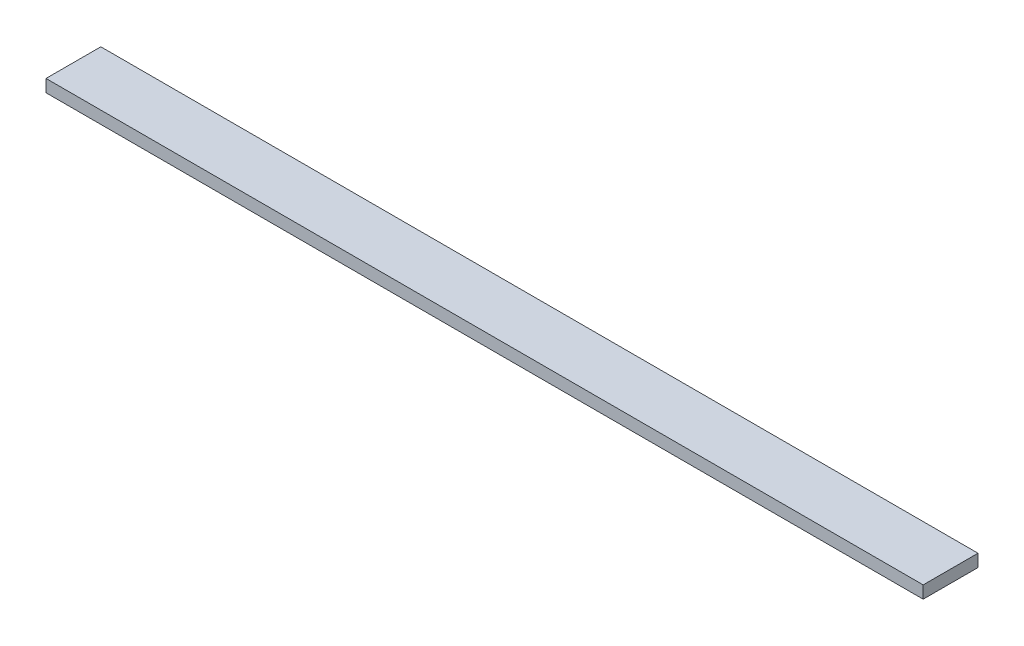
ISO-10303-21;
HEADER;
FILE_DESCRIPTION(('STEP AP214'),'2;1');
FILE_NAME('part.step','',(''),(''),'','','');
FILE_SCHEMA(('AUTOMOTIVE_DESIGN { 1 0 10303 214 1 1 1 1 }'));
ENDSEC;
DATA;
#1=APPLICATION_CONTEXT('core data for automotive mechanical design processes');
#2=APPLICATION_PROTOCOL_DEFINITION('international standard','automotive_design',2000,#1);
#3=PRODUCT_CONTEXT('',#1,'mechanical');
#4=PRODUCT('Part','Part','',(#3));
#5=PRODUCT_RELATED_PRODUCT_CATEGORY('part','',(#4));
#6=PRODUCT_DEFINITION_FORMATION('','',#4);
#7=PRODUCT_DEFINITION_CONTEXT('part definition',#1,'design');
#8=PRODUCT_DEFINITION('design','',#6,#7);
#9=PRODUCT_DEFINITION_SHAPE('','',#8);
#10=(LENGTH_UNIT() NAMED_UNIT(*) SI_UNIT(.MILLI.,.METRE.));
#11=(NAMED_UNIT(*) PLANE_ANGLE_UNIT() SI_UNIT($,.RADIAN.));
#12=(NAMED_UNIT(*) SI_UNIT($,.STERADIAN.) SOLID_ANGLE_UNIT());
#13=UNCERTAINTY_MEASURE_WITH_UNIT(LENGTH_MEASURE(1.E-05),#10,'distance_accuracy_value','');
#14=(GEOMETRIC_REPRESENTATION_CONTEXT(3) GLOBAL_UNCERTAINTY_ASSIGNED_CONTEXT((#13)) GLOBAL_UNIT_ASSIGNED_CONTEXT((#10,
#11,#12)) REPRESENTATION_CONTEXT('',''));
#15=CARTESIAN_POINT('',(0.,0.,0.));
#16=DIRECTION('',(0.,0.,1.));
#17=DIRECTION('',(1.,0.,0.));
#18=AXIS2_PLACEMENT_3D('',#15,#16,#17);
#19=CARTESIAN_POINT('',(600.,17.,-37.5));
#20=DIRECTION('',(-1.,0.,0.));
#21=DIRECTION('',(0.,0.,1.));
#22=AXIS2_PLACEMENT_3D('',#19,#20,#21);
#23=PLANE('',#22);
#24=DIRECTION('',(0.,0.,-1.));
#25=VECTOR('',#24,1.);
#26=CARTESIAN_POINT('',(600.,0.,-37.5));
#27=LINE('',#26,#25);
#28=CARTESIAN_POINT('',(600.,0.,37.5));
#29=VERTEX_POINT('',#28);
#30=CARTESIAN_POINT('',(600.,0.,-37.5));
#31=VERTEX_POINT('',#30);
#32=EDGE_CURVE('E107',#29,#31,#27,.T.);
#33=ORIENTED_EDGE('',*,*,#32,.T.);
#34=DIRECTION('',(0.,-1.,0.));
#35=VECTOR('',#34,1.);
#36=CARTESIAN_POINT('',(600.,17.,-37.5));
#37=LINE('',#36,#35);
#38=CARTESIAN_POINT('',(600.,17.,-37.5));
#39=VERTEX_POINT('',#38);
#40=EDGE_CURVE('E11',#39,#31,#37,.T.);
#41=ORIENTED_EDGE('',*,*,#40,.F.);
#42=DIRECTION('',(0.,0.,-1.));
#43=VECTOR('',#42,1.);
#44=CARTESIAN_POINT('',(600.,17.,-37.5));
#45=LINE('',#44,#43);
#46=CARTESIAN_POINT('',(600.,17.,37.5));
#47=VERTEX_POINT('',#46);
#48=EDGE_CURVE('E91',#47,#39,#45,.T.);
#49=ORIENTED_EDGE('',*,*,#48,.F.);
#50=DIRECTION('',(0.,-1.,0.));
#51=VECTOR('',#50,1.);
#52=CARTESIAN_POINT('',(600.,17.,37.5));
#53=LINE('',#52,#51);
#54=EDGE_CURVE('E103',#47,#29,#53,.T.);
#55=ORIENTED_EDGE('',*,*,#54,.T.);
#56=EDGE_LOOP('',(#33,#41,#49,#55));
#57=FACE_BOUND('',#56,.T.);
#58=ADVANCED_FACE('F39',(#57),#23,.F.);
#59=CARTESIAN_POINT('',(-600.,17.,-37.5));
#60=DIRECTION('',(0.,0.,1.));
#61=DIRECTION('',(1.,0.,0.));
#62=AXIS2_PLACEMENT_3D('',#59,#60,#61);
#63=PLANE('',#62);
#64=DIRECTION('',(-1.,0.,0.));
#65=VECTOR('',#64,1.);
#66=CARTESIAN_POINT('',(-600.,0.,-37.5));
#67=LINE('',#66,#65);
#68=CARTESIAN_POINT('',(-600.,0.,-37.5));
#69=VERTEX_POINT('',#68);
#70=EDGE_CURVE('E96',#31,#69,#67,.T.);
#71=ORIENTED_EDGE('',*,*,#70,.T.);
#72=DIRECTION('',(0.,-1.,0.));
#73=VECTOR('',#72,1.);
#74=CARTESIAN_POINT('',(-600.,17.,-37.5));
#75=LINE('',#74,#73);
#76=CARTESIAN_POINT('',(-600.,17.,-37.5));
#77=VERTEX_POINT('',#76);
#78=EDGE_CURVE('E48',#77,#69,#75,.T.);
#79=ORIENTED_EDGE('',*,*,#78,.F.);
#80=DIRECTION('',(-1.,0.,0.));
#81=VECTOR('',#80,1.);
#82=CARTESIAN_POINT('',(-600.,17.,-37.5));
#83=LINE('',#82,#81);
#84=EDGE_CURVE('E86',#39,#77,#83,.T.);
#85=ORIENTED_EDGE('',*,*,#84,.F.);
#86=ORIENTED_EDGE('',*,*,#40,.T.);
#87=EDGE_LOOP('',(#71,#79,#85,#86));
#88=FACE_BOUND('',#87,.T.);
#89=ADVANCED_FACE('F95',(#88),#63,.F.);
#90=CARTESIAN_POINT('',(-600.,17.,-37.5));
#91=DIRECTION('',(1.,0.,0.));
#92=DIRECTION('',(0.,0.,-1.));
#93=AXIS2_PLACEMENT_3D('',#90,#91,#92);
#94=PLANE('',#93);
#95=DIRECTION('',(0.,0.,1.));
#96=VECTOR('',#95,1.);
#97=CARTESIAN_POINT('',(-600.,0.,-37.5));
#98=LINE('',#97,#96);
#99=CARTESIAN_POINT('',(-600.,0.,37.5));
#100=VERTEX_POINT('',#99);
#101=EDGE_CURVE('E73',#69,#100,#98,.T.);
#102=ORIENTED_EDGE('',*,*,#101,.T.);
#103=DIRECTION('',(0.,-1.,0.));
#104=VECTOR('',#103,1.);
#105=CARTESIAN_POINT('',(-600.,17.,37.5));
#106=LINE('',#105,#104);
#107=CARTESIAN_POINT('',(-600.,17.,37.5));
#108=VERTEX_POINT('',#107);
#109=EDGE_CURVE('E98',#108,#100,#106,.T.);
#110=ORIENTED_EDGE('',*,*,#109,.F.);
#111=DIRECTION('',(0.,0.,1.));
#112=VECTOR('',#111,1.);
#113=CARTESIAN_POINT('',(-600.,17.,-37.5));
#114=LINE('',#113,#112);
#115=EDGE_CURVE('E89',#77,#108,#114,.T.);
#116=ORIENTED_EDGE('',*,*,#115,.F.);
#117=ORIENTED_EDGE('',*,*,#78,.T.);
#118=EDGE_LOOP('',(#102,#110,#116,#117));
#119=FACE_BOUND('',#118,.T.);
#120=ADVANCED_FACE('F99',(#119),#94,.F.);
#121=CARTESIAN_POINT('',(-600.,17.,37.5));
#122=DIRECTION('',(0.,0.,-1.));
#123=DIRECTION('',(-1.,0.,0.));
#124=AXIS2_PLACEMENT_3D('',#121,#122,#123);
#125=PLANE('',#124);
#126=DIRECTION('',(1.,0.,0.));
#127=VECTOR('',#126,1.);
#128=CARTESIAN_POINT('',(-600.,0.,37.5));
#129=LINE('',#128,#127);
#130=EDGE_CURVE('E79',#100,#29,#129,.T.);
#131=ORIENTED_EDGE('',*,*,#130,.T.);
#132=ORIENTED_EDGE('',*,*,#54,.F.);
#133=DIRECTION('',(1.,0.,0.));
#134=VECTOR('',#133,1.);
#135=CARTESIAN_POINT('',(-600.,17.,37.5));
#136=LINE('',#135,#134);
#137=EDGE_CURVE('E56',#108,#47,#136,.T.);
#138=ORIENTED_EDGE('',*,*,#137,.F.);
#139=ORIENTED_EDGE('',*,*,#109,.T.);
#140=EDGE_LOOP('',(#131,#132,#138,#139));
#141=FACE_BOUND('',#140,.T.);
#142=ADVANCED_FACE('F120',(#141),#125,.F.);
#143=CARTESIAN_POINT('',(0.,17.,0.));
#144=DIRECTION('',(0.,1.,0.));
#145=DIRECTION('',(0.,0.,1.));
#146=AXIS2_PLACEMENT_3D('',#143,#144,#145);
#147=PLANE('',#146);
#148=ORIENTED_EDGE('',*,*,#48,.T.);
#149=ORIENTED_EDGE('',*,*,#84,.T.);
#150=ORIENTED_EDGE('',*,*,#115,.T.);
#151=ORIENTED_EDGE('',*,*,#137,.T.);
#152=EDGE_LOOP('',(#148,#149,#150,#151));
#153=FACE_BOUND('',#152,.T.);
#154=ADVANCED_FACE('F87',(#153),#147,.T.);
#155=CARTESIAN_POINT('',(0.,0.,0.));
#156=DIRECTION('',(0.,1.,0.));
#157=DIRECTION('',(0.,0.,1.));
#158=AXIS2_PLACEMENT_3D('',#155,#156,#157);
#159=PLANE('',#158);
#160=ORIENTED_EDGE('',*,*,#32,.F.);
#161=ORIENTED_EDGE('',*,*,#130,.F.);
#162=ORIENTED_EDGE('',*,*,#101,.F.);
#163=ORIENTED_EDGE('',*,*,#70,.F.);
#164=EDGE_LOOP('',(#160,#161,#162,#163));
#165=FACE_BOUND('',#164,.T.);
#166=ADVANCED_FACE('F123',(#165),#159,.F.);
#167=CLOSED_SHELL('',(#58,#89,#120,#142,#154,#166));
#168=MANIFOLD_SOLID_BREP('B2',#167);
#169=ADVANCED_BREP_SHAPE_REPRESENTATION('',(#18,#168),#14);
#170=SHAPE_DEFINITION_REPRESENTATION(#9,#169);
ENDSEC;
END-ISO-10303-21;
